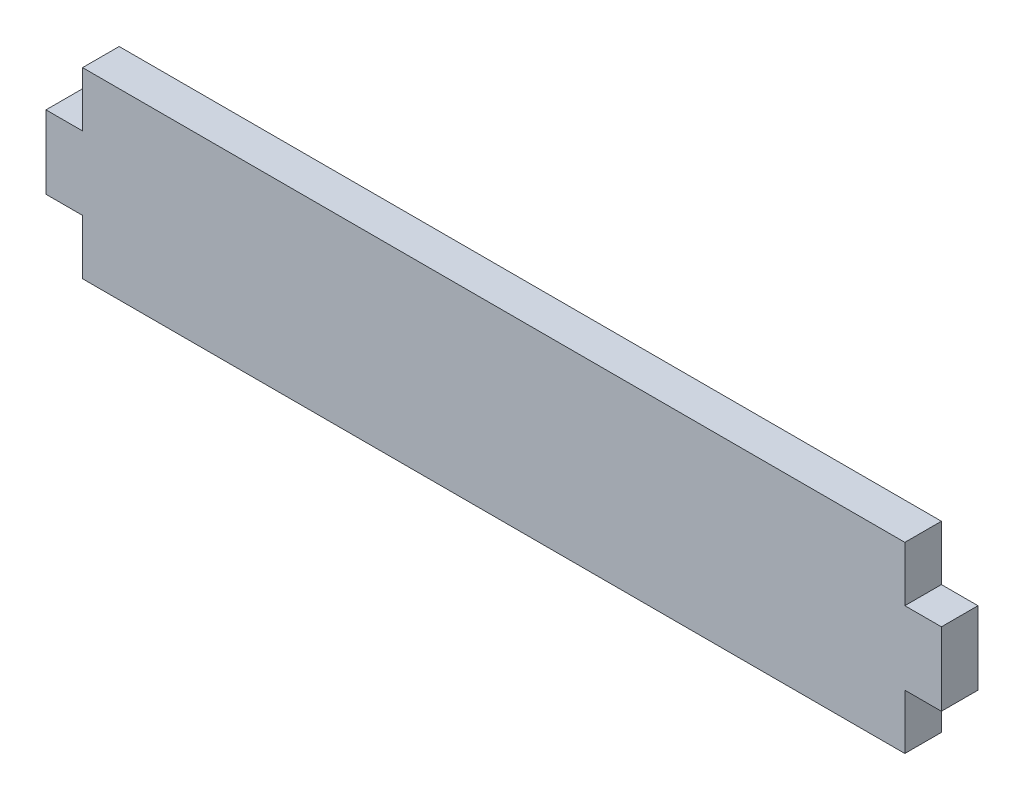
ISO-10303-21;
HEADER;
FILE_DESCRIPTION(('STEP AP214'),'2;1');
FILE_NAME('part.step','',(''),(''),'','','');
FILE_SCHEMA(('AUTOMOTIVE_DESIGN { 1 0 10303 214 1 1 1 1 }'));
ENDSEC;
DATA;
#1=APPLICATION_CONTEXT('core data for automotive mechanical design processes');
#2=APPLICATION_PROTOCOL_DEFINITION('international standard','automotive_design',2000,#1);
#3=PRODUCT_CONTEXT('',#1,'mechanical');
#4=PRODUCT('Part','Part','',(#3));
#5=PRODUCT_RELATED_PRODUCT_CATEGORY('part','',(#4));
#6=PRODUCT_DEFINITION_FORMATION('','',#4);
#7=PRODUCT_DEFINITION_CONTEXT('part definition',#1,'design');
#8=PRODUCT_DEFINITION('design','',#6,#7);
#9=PRODUCT_DEFINITION_SHAPE('','',#8);
#10=(LENGTH_UNIT() NAMED_UNIT(*) SI_UNIT(.MILLI.,.METRE.));
#11=(NAMED_UNIT(*) PLANE_ANGLE_UNIT() SI_UNIT($,.RADIAN.));
#12=(NAMED_UNIT(*) SI_UNIT($,.STERADIAN.) SOLID_ANGLE_UNIT());
#13=UNCERTAINTY_MEASURE_WITH_UNIT(LENGTH_MEASURE(1.E-05),#10,'distance_accuracy_value','');
#14=(GEOMETRIC_REPRESENTATION_CONTEXT(3) GLOBAL_UNCERTAINTY_ASSIGNED_CONTEXT((#13)) GLOBAL_UNIT_ASSIGNED_CONTEXT((#10,
#11,#12)) REPRESENTATION_CONTEXT('',''));
#15=CARTESIAN_POINT('',(0.,0.,0.));
#16=DIRECTION('',(0.,0.,1.));
#17=DIRECTION('',(1.,0.,0.));
#18=AXIS2_PLACEMENT_3D('',#15,#16,#17);
#19=CARTESIAN_POINT('',(56.2,-5.,5.));
#20=DIRECTION('',(-1.,0.,0.));
#21=DIRECTION('',(0.,0.,1.));
#22=AXIS2_PLACEMENT_3D('',#19,#20,#21);
#23=PLANE('',#22);
#24=DIRECTION('',(0.,1.,0.));
#25=VECTOR('',#24,1.);
#26=CARTESIAN_POINT('',(56.2,-5.,0.));
#27=LINE('',#26,#25);
#28=CARTESIAN_POINT('',(56.2,-12.5,0.));
#29=VERTEX_POINT('',#28);
#30=CARTESIAN_POINT('',(56.2,-5.,0.));
#31=VERTEX_POINT('',#30);
#32=EDGE_CURVE('E156',#29,#31,#27,.T.);
#33=ORIENTED_EDGE('',*,*,#32,.T.);
#34=DIRECTION('',(0.,0.,-1.));
#35=VECTOR('',#34,1.);
#36=CARTESIAN_POINT('',(56.2,-5.,5.));
#37=LINE('',#36,#35);
#38=CARTESIAN_POINT('',(56.2,-5.,5.));
#39=VERTEX_POINT('',#38);
#40=EDGE_CURVE('E11',#39,#31,#37,.T.);
#41=ORIENTED_EDGE('',*,*,#40,.F.);
#42=DIRECTION('',(0.,1.,0.));
#43=VECTOR('',#42,1.);
#44=CARTESIAN_POINT('',(56.2,-5.,5.));
#45=LINE('',#44,#43);
#46=CARTESIAN_POINT('',(56.2,-12.5,5.));
#47=VERTEX_POINT('',#46);
#48=EDGE_CURVE('E178',#47,#39,#45,.T.);
#49=ORIENTED_EDGE('',*,*,#48,.F.);
#50=DIRECTION('',(0.,0.,-1.));
#51=VECTOR('',#50,1.);
#52=CARTESIAN_POINT('',(56.2,-12.5,5.));
#53=LINE('',#52,#51);
#54=EDGE_CURVE('E152',#47,#29,#53,.T.);
#55=ORIENTED_EDGE('',*,*,#54,.T.);
#56=EDGE_LOOP('',(#33,#41,#49,#55));
#57=FACE_BOUND('',#56,.T.);
#58=ADVANCED_FACE('F36',(#57),#23,.F.);
#59=CARTESIAN_POINT('',(61.2000000000001,-5.,5.));
#60=DIRECTION('',(0.,1.,0.));
#61=DIRECTION('',(-1.,0.,0.));
#62=AXIS2_PLACEMENT_3D('',#59,#60,#61);
#63=PLANE('',#62);
#64=DIRECTION('',(1.,0.,0.));
#65=VECTOR('',#64,1.);
#66=CARTESIAN_POINT('',(61.2000000000001,-5.,0.));
#67=LINE('',#66,#65);
#68=CARTESIAN_POINT('',(61.2000000000001,-5.,0.));
#69=VERTEX_POINT('',#68);
#70=EDGE_CURVE('E159',#31,#69,#67,.T.);
#71=ORIENTED_EDGE('',*,*,#70,.T.);
#72=DIRECTION('',(0.,0.,-1.));
#73=VECTOR('',#72,1.);
#74=CARTESIAN_POINT('',(61.2000000000001,-5.,5.));
#75=LINE('',#74,#73);
#76=CARTESIAN_POINT('',(61.2000000000001,-5.,5.));
#77=VERTEX_POINT('',#76);
#78=EDGE_CURVE('E44',#77,#69,#75,.T.);
#79=ORIENTED_EDGE('',*,*,#78,.F.);
#80=DIRECTION('',(1.,0.,0.));
#81=VECTOR('',#80,1.);
#82=CARTESIAN_POINT('',(61.2000000000001,-5.,5.));
#83=LINE('',#82,#81);
#84=EDGE_CURVE('E107',#39,#77,#83,.T.);
#85=ORIENTED_EDGE('',*,*,#84,.F.);
#86=ORIENTED_EDGE('',*,*,#40,.T.);
#87=EDGE_LOOP('',(#71,#79,#85,#86));
#88=FACE_BOUND('',#87,.T.);
#89=ADVANCED_FACE('F256',(#88),#63,.F.);
#90=CARTESIAN_POINT('',(61.2,5.,5.));
#91=DIRECTION('',(-1.,0.,0.));
#92=DIRECTION('',(0.,-1.,0.));
#93=AXIS2_PLACEMENT_3D('',#90,#91,#92);
#94=PLANE('',#93);
#95=DIRECTION('',(0.,1.,0.));
#96=VECTOR('',#95,1.);
#97=CARTESIAN_POINT('',(61.2,5.,0.));
#98=LINE('',#97,#96);
#99=CARTESIAN_POINT('',(61.2,5.,0.));
#100=VERTEX_POINT('',#99);
#101=EDGE_CURVE('E161',#69,#100,#98,.T.);
#102=ORIENTED_EDGE('',*,*,#101,.T.);
#103=DIRECTION('',(0.,0.,-1.));
#104=VECTOR('',#103,1.);
#105=CARTESIAN_POINT('',(61.2,5.,5.));
#106=LINE('',#105,#104);
#107=CARTESIAN_POINT('',(61.2,5.,5.));
#108=VERTEX_POINT('',#107);
#109=EDGE_CURVE('E197',#108,#100,#106,.T.);
#110=ORIENTED_EDGE('',*,*,#109,.F.);
#111=DIRECTION('',(0.,1.,0.));
#112=VECTOR('',#111,1.);
#113=CARTESIAN_POINT('',(61.2,5.,5.));
#114=LINE('',#113,#112);
#115=EDGE_CURVE('E205',#77,#108,#114,.T.);
#116=ORIENTED_EDGE('',*,*,#115,.F.);
#117=ORIENTED_EDGE('',*,*,#78,.T.);
#118=EDGE_LOOP('',(#102,#110,#116,#117));
#119=FACE_BOUND('',#118,.T.);
#120=ADVANCED_FACE('F203',(#119),#94,.F.);
#121=CARTESIAN_POINT('',(61.2,5.,5.));
#122=DIRECTION('',(0.,-1.,0.));
#123=DIRECTION('',(1.,0.,0.));
#124=AXIS2_PLACEMENT_3D('',#121,#122,#123);
#125=PLANE('',#124);
#126=DIRECTION('',(-1.,0.,0.));
#127=VECTOR('',#126,1.);
#128=CARTESIAN_POINT('',(61.2,5.,0.));
#129=LINE('',#128,#127);
#130=CARTESIAN_POINT('',(56.2,5.,0.));
#131=VERTEX_POINT('',#130);
#132=EDGE_CURVE('E163',#100,#131,#129,.T.);
#133=ORIENTED_EDGE('',*,*,#132,.T.);
#134=DIRECTION('',(0.,0.,-1.));
#135=VECTOR('',#134,1.);
#136=CARTESIAN_POINT('',(56.2,5.,5.));
#137=LINE('',#136,#135);
#138=CARTESIAN_POINT('',(56.2,5.,5.));
#139=VERTEX_POINT('',#138);
#140=EDGE_CURVE('E194',#139,#131,#137,.T.);
#141=ORIENTED_EDGE('',*,*,#140,.F.);
#142=DIRECTION('',(-1.,0.,0.));
#143=VECTOR('',#142,1.);
#144=CARTESIAN_POINT('',(61.2,5.,5.));
#145=LINE('',#144,#143);
#146=EDGE_CURVE('E223',#108,#139,#145,.T.);
#147=ORIENTED_EDGE('',*,*,#146,.F.);
#148=ORIENTED_EDGE('',*,*,#109,.T.);
#149=EDGE_LOOP('',(#133,#141,#147,#148));
#150=FACE_BOUND('',#149,.T.);
#151=ADVANCED_FACE('F214',(#150),#125,.F.);
#152=CARTESIAN_POINT('',(56.2,12.5,5.));
#153=DIRECTION('',(-1.,0.,0.));
#154=DIRECTION('',(0.,0.,1.));
#155=AXIS2_PLACEMENT_3D('',#152,#153,#154);
#156=PLANE('',#155);
#157=DIRECTION('',(0.,1.,0.));
#158=VECTOR('',#157,1.);
#159=CARTESIAN_POINT('',(56.2,12.5,0.));
#160=LINE('',#159,#158);
#161=CARTESIAN_POINT('',(56.2,12.5,0.));
#162=VERTEX_POINT('',#161);
#163=EDGE_CURVE('E165',#131,#162,#160,.T.);
#164=ORIENTED_EDGE('',*,*,#163,.T.);
#165=DIRECTION('',(0.,0.,-1.));
#166=VECTOR('',#165,1.);
#167=CARTESIAN_POINT('',(56.2,12.5,5.));
#168=LINE('',#167,#166);
#169=CARTESIAN_POINT('',(56.2,12.5,5.));
#170=VERTEX_POINT('',#169);
#171=EDGE_CURVE('E191',#170,#162,#168,.T.);
#172=ORIENTED_EDGE('',*,*,#171,.F.);
#173=DIRECTION('',(0.,1.,0.));
#174=VECTOR('',#173,1.);
#175=CARTESIAN_POINT('',(56.2,12.5,5.));
#176=LINE('',#175,#174);
#177=EDGE_CURVE('E220',#139,#170,#176,.T.);
#178=ORIENTED_EDGE('',*,*,#177,.F.);
#179=ORIENTED_EDGE('',*,*,#140,.T.);
#180=EDGE_LOOP('',(#164,#172,#178,#179));
#181=FACE_BOUND('',#180,.T.);
#182=ADVANCED_FACE('F218',(#181),#156,.F.);
#183=CARTESIAN_POINT('',(-56.2,12.5,5.));
#184=DIRECTION('',(0.,-1.,0.));
#185=DIRECTION('',(0.,0.,-1.));
#186=AXIS2_PLACEMENT_3D('',#183,#184,#185);
#187=PLANE('',#186);
#188=DIRECTION('',(-1.,0.,0.));
#189=VECTOR('',#188,1.);
#190=CARTESIAN_POINT('',(-56.2,12.5,0.));
#191=LINE('',#190,#189);
#192=CARTESIAN_POINT('',(-56.2,12.5,0.));
#193=VERTEX_POINT('',#192);
#194=EDGE_CURVE('E167',#162,#193,#191,.T.);
#195=ORIENTED_EDGE('',*,*,#194,.T.);
#196=DIRECTION('',(0.,0.,-1.));
#197=VECTOR('',#196,1.);
#198=CARTESIAN_POINT('',(-56.2,12.5,5.));
#199=LINE('',#198,#197);
#200=CARTESIAN_POINT('',(-56.2,12.5,5.));
#201=VERTEX_POINT('',#200);
#202=EDGE_CURVE('E188',#201,#193,#199,.T.);
#203=ORIENTED_EDGE('',*,*,#202,.F.);
#204=DIRECTION('',(-1.,0.,0.));
#205=VECTOR('',#204,1.);
#206=CARTESIAN_POINT('',(-56.2,12.5,5.));
#207=LINE('',#206,#205);
#208=EDGE_CURVE('E222',#170,#201,#207,.T.);
#209=ORIENTED_EDGE('',*,*,#208,.F.);
#210=ORIENTED_EDGE('',*,*,#171,.T.);
#211=EDGE_LOOP('',(#195,#203,#209,#210));
#212=FACE_BOUND('',#211,.T.);
#213=ADVANCED_FACE('F269',(#212),#187,.F.);
#214=CARTESIAN_POINT('',(-56.2,12.5,5.));
#215=DIRECTION('',(1.,0.,0.));
#216=DIRECTION('',(0.,0.,-1.));
#217=AXIS2_PLACEMENT_3D('',#214,#215,#216);
#218=PLANE('',#217);
#219=DIRECTION('',(0.,-1.,0.));
#220=VECTOR('',#219,1.);
#221=CARTESIAN_POINT('',(-56.2,12.5,0.));
#222=LINE('',#221,#220);
#223=CARTESIAN_POINT('',(-56.2,5.,0.));
#224=VERTEX_POINT('',#223);
#225=EDGE_CURVE('E169',#193,#224,#222,.T.);
#226=ORIENTED_EDGE('',*,*,#225,.T.);
#227=DIRECTION('',(0.,0.,-1.));
#228=VECTOR('',#227,1.);
#229=CARTESIAN_POINT('',(-56.2,5.,5.));
#230=LINE('',#229,#228);
#231=CARTESIAN_POINT('',(-56.2,5.,5.));
#232=VERTEX_POINT('',#231);
#233=EDGE_CURVE('E185',#232,#224,#230,.T.);
#234=ORIENTED_EDGE('',*,*,#233,.F.);
#235=DIRECTION('',(0.,-1.,0.));
#236=VECTOR('',#235,1.);
#237=CARTESIAN_POINT('',(-56.2,12.5,5.));
#238=LINE('',#237,#236);
#239=EDGE_CURVE('E225',#201,#232,#238,.T.);
#240=ORIENTED_EDGE('',*,*,#239,.F.);
#241=ORIENTED_EDGE('',*,*,#202,.T.);
#242=EDGE_LOOP('',(#226,#234,#240,#241));
#243=FACE_BOUND('',#242,.T.);
#244=ADVANCED_FACE('F272',(#243),#218,.F.);
#245=CARTESIAN_POINT('',(-61.2,5.,5.));
#246=DIRECTION('',(0.,-1.,0.));
#247=DIRECTION('',(0.,0.,-1.));
#248=AXIS2_PLACEMENT_3D('',#245,#246,#247);
#249=PLANE('',#248);
#250=DIRECTION('',(-1.,0.,0.));
#251=VECTOR('',#250,1.);
#252=CARTESIAN_POINT('',(-61.2,5.,0.));
#253=LINE('',#252,#251);
#254=CARTESIAN_POINT('',(-61.2,5.,0.));
#255=VERTEX_POINT('',#254);
#256=EDGE_CURVE('E171',#224,#255,#253,.T.);
#257=ORIENTED_EDGE('',*,*,#256,.T.);
#258=DIRECTION('',(0.,0.,-1.));
#259=VECTOR('',#258,1.);
#260=CARTESIAN_POINT('',(-61.2,5.,5.));
#261=LINE('',#260,#259);
#262=CARTESIAN_POINT('',(-61.2,5.,5.));
#263=VERTEX_POINT('',#262);
#264=EDGE_CURVE('E182',#263,#255,#261,.T.);
#265=ORIENTED_EDGE('',*,*,#264,.F.);
#266=DIRECTION('',(-1.,0.,0.));
#267=VECTOR('',#266,1.);
#268=CARTESIAN_POINT('',(-61.2,5.,5.));
#269=LINE('',#268,#267);
#270=EDGE_CURVE('E231',#232,#263,#269,.T.);
#271=ORIENTED_EDGE('',*,*,#270,.F.);
#272=ORIENTED_EDGE('',*,*,#233,.T.);
#273=EDGE_LOOP('',(#257,#265,#271,#272));
#274=FACE_BOUND('',#273,.T.);
#275=ADVANCED_FACE('F237',(#274),#249,.F.);
#276=CARTESIAN_POINT('',(-61.2,5.,5.));
#277=DIRECTION('',(1.,0.,0.));
#278=DIRECTION('',(0.,0.,-1.));
#279=AXIS2_PLACEMENT_3D('',#276,#277,#278);
#280=PLANE('',#279);
#281=DIRECTION('',(0.,-1.,0.));
#282=VECTOR('',#281,1.);
#283=CARTESIAN_POINT('',(-61.2,5.,0.));
#284=LINE('',#283,#282);
#285=CARTESIAN_POINT('',(-61.2,-5.,0.));
#286=VERTEX_POINT('',#285);
#287=EDGE_CURVE('E173',#255,#286,#284,.T.);
#288=ORIENTED_EDGE('',*,*,#287,.T.);
#289=DIRECTION('',(0.,0.,-1.));
#290=VECTOR('',#289,1.);
#291=CARTESIAN_POINT('',(-61.2,-5.,5.));
#292=LINE('',#291,#290);
#293=CARTESIAN_POINT('',(-61.2,-5.,5.));
#294=VERTEX_POINT('',#293);
#295=EDGE_CURVE('E147',#294,#286,#292,.T.);
#296=ORIENTED_EDGE('',*,*,#295,.F.);
#297=DIRECTION('',(0.,-1.,0.));
#298=VECTOR('',#297,1.);
#299=CARTESIAN_POINT('',(-61.2,5.,5.));
#300=LINE('',#299,#298);
#301=EDGE_CURVE('E138',#263,#294,#300,.T.);
#302=ORIENTED_EDGE('',*,*,#301,.F.);
#303=ORIENTED_EDGE('',*,*,#264,.T.);
#304=EDGE_LOOP('',(#288,#296,#302,#303));
#305=FACE_BOUND('',#304,.T.);
#306=ADVANCED_FACE('F241',(#305),#280,.F.);
#307=CARTESIAN_POINT('',(-61.2,-5.,5.));
#308=DIRECTION('',(0.,1.,0.));
#309=DIRECTION('',(0.,0.,1.));
#310=AXIS2_PLACEMENT_3D('',#307,#308,#309);
#311=PLANE('',#310);
#312=DIRECTION('',(1.,0.,0.));
#313=VECTOR('',#312,1.);
#314=CARTESIAN_POINT('',(-61.2,-5.,0.));
#315=LINE('',#314,#313);
#316=CARTESIAN_POINT('',(-56.2,-5.,0.));
#317=VERTEX_POINT('',#316);
#318=EDGE_CURVE('E146',#286,#317,#315,.T.);
#319=ORIENTED_EDGE('',*,*,#318,.T.);
#320=DIRECTION('',(0.,0.,-1.));
#321=VECTOR('',#320,1.);
#322=CARTESIAN_POINT('',(-56.2,-5.,5.));
#323=LINE('',#322,#321);
#324=CARTESIAN_POINT('',(-56.2,-5.,5.));
#325=VERTEX_POINT('',#324);
#326=EDGE_CURVE('E143',#325,#317,#323,.T.);
#327=ORIENTED_EDGE('',*,*,#326,.F.);
#328=DIRECTION('',(1.,0.,0.));
#329=VECTOR('',#328,1.);
#330=CARTESIAN_POINT('',(-61.2,-5.,5.));
#331=LINE('',#330,#329);
#332=EDGE_CURVE('E132',#294,#325,#331,.T.);
#333=ORIENTED_EDGE('',*,*,#332,.F.);
#334=ORIENTED_EDGE('',*,*,#295,.T.);
#335=EDGE_LOOP('',(#319,#327,#333,#334));
#336=FACE_BOUND('',#335,.T.);
#337=ADVANCED_FACE('F144',(#336),#311,.F.);
#338=CARTESIAN_POINT('',(-56.2,-5.,5.));
#339=DIRECTION('',(1.,0.,0.));
#340=DIRECTION('',(0.,1.,0.));
#341=AXIS2_PLACEMENT_3D('',#338,#339,#340);
#342=PLANE('',#341);
#343=DIRECTION('',(0.,-1.,0.));
#344=VECTOR('',#343,1.);
#345=CARTESIAN_POINT('',(-56.2,-5.,0.));
#346=LINE('',#345,#344);
#347=CARTESIAN_POINT('',(-56.2,-12.5,0.));
#348=VERTEX_POINT('',#347);
#349=EDGE_CURVE('E93',#317,#348,#346,.T.);
#350=ORIENTED_EDGE('',*,*,#349,.T.);
#351=DIRECTION('',(0.,0.,-1.));
#352=VECTOR('',#351,1.);
#353=CARTESIAN_POINT('',(-56.2,-12.5,5.));
#354=LINE('',#353,#352);
#355=CARTESIAN_POINT('',(-56.2,-12.5,5.));
#356=VERTEX_POINT('',#355);
#357=EDGE_CURVE('E148',#356,#348,#354,.T.);
#358=ORIENTED_EDGE('',*,*,#357,.F.);
#359=DIRECTION('',(0.,-1.,0.));
#360=VECTOR('',#359,1.);
#361=CARTESIAN_POINT('',(-56.2,-5.,5.));
#362=LINE('',#361,#360);
#363=EDGE_CURVE('E136',#325,#356,#362,.T.);
#364=ORIENTED_EDGE('',*,*,#363,.F.);
#365=ORIENTED_EDGE('',*,*,#326,.T.);
#366=EDGE_LOOP('',(#350,#358,#364,#365));
#367=FACE_BOUND('',#366,.T.);
#368=ADVANCED_FACE('F150',(#367),#342,.F.);
#369=CARTESIAN_POINT('',(-56.2,-12.5,5.));
#370=DIRECTION('',(0.,1.,0.));
#371=DIRECTION('',(0.,0.,1.));
#372=AXIS2_PLACEMENT_3D('',#369,#370,#371);
#373=PLANE('',#372);
#374=DIRECTION('',(1.,0.,0.));
#375=VECTOR('',#374,1.);
#376=CARTESIAN_POINT('',(-56.2,-12.5,0.));
#377=LINE('',#376,#375);
#378=EDGE_CURVE('E99',#348,#29,#377,.T.);
#379=ORIENTED_EDGE('',*,*,#378,.T.);
#380=ORIENTED_EDGE('',*,*,#54,.F.);
#381=DIRECTION('',(1.,0.,0.));
#382=VECTOR('',#381,1.);
#383=CARTESIAN_POINT('',(-56.2,-12.5,5.));
#384=LINE('',#383,#382);
#385=EDGE_CURVE('E52',#356,#47,#384,.T.);
#386=ORIENTED_EDGE('',*,*,#385,.F.);
#387=ORIENTED_EDGE('',*,*,#357,.T.);
#388=EDGE_LOOP('',(#379,#380,#386,#387));
#389=FACE_BOUND('',#388,.T.);
#390=ADVANCED_FACE('F245',(#389),#373,.F.);
#391=CARTESIAN_POINT('',(0.,0.,5.));
#392=DIRECTION('',(0.,0.,1.));
#393=DIRECTION('',(1.,0.,0.));
#394=AXIS2_PLACEMENT_3D('',#391,#392,#393);
#395=PLANE('',#394);
#396=ORIENTED_EDGE('',*,*,#48,.T.);
#397=ORIENTED_EDGE('',*,*,#84,.T.);
#398=ORIENTED_EDGE('',*,*,#115,.T.);
#399=ORIENTED_EDGE('',*,*,#146,.T.);
#400=ORIENTED_EDGE('',*,*,#177,.T.);
#401=ORIENTED_EDGE('',*,*,#208,.T.);
#402=ORIENTED_EDGE('',*,*,#239,.T.);
#403=ORIENTED_EDGE('',*,*,#270,.T.);
#404=ORIENTED_EDGE('',*,*,#301,.T.);
#405=ORIENTED_EDGE('',*,*,#332,.T.);
#406=ORIENTED_EDGE('',*,*,#363,.T.);
#407=ORIENTED_EDGE('',*,*,#385,.T.);
#408=EDGE_LOOP('',(#396,#397,#398,#399,#400,#401,#402,#403,#404,#405,#406,#407));
#409=FACE_BOUND('',#408,.T.);
#410=ADVANCED_FACE('F134',(#409),#395,.T.);
#411=CARTESIAN_POINT('',(0.,0.,0.));
#412=DIRECTION('',(0.,0.,1.));
#413=DIRECTION('',(1.,0.,0.));
#414=AXIS2_PLACEMENT_3D('',#411,#412,#413);
#415=PLANE('',#414);
#416=ORIENTED_EDGE('',*,*,#32,.F.);
#417=ORIENTED_EDGE('',*,*,#378,.F.);
#418=ORIENTED_EDGE('',*,*,#349,.F.);
#419=ORIENTED_EDGE('',*,*,#318,.F.);
#420=ORIENTED_EDGE('',*,*,#287,.F.);
#421=ORIENTED_EDGE('',*,*,#256,.F.);
#422=ORIENTED_EDGE('',*,*,#225,.F.);
#423=ORIENTED_EDGE('',*,*,#194,.F.);
#424=ORIENTED_EDGE('',*,*,#163,.F.);
#425=ORIENTED_EDGE('',*,*,#132,.F.);
#426=ORIENTED_EDGE('',*,*,#101,.F.);
#427=ORIENTED_EDGE('',*,*,#70,.F.);
#428=EDGE_LOOP('',(#416,#417,#418,#419,#420,#421,#422,#423,#424,#425,#426,#427));
#429=FACE_BOUND('',#428,.T.);
#430=ADVANCED_FACE('F209',(#429),#415,.F.);
#431=CLOSED_SHELL('',(#58,#89,#120,#151,#182,#213,#244,#275,#306,#337,#368,#390,#410,#430));
#432=MANIFOLD_SOLID_BREP('B2',#431);
#433=ADVANCED_BREP_SHAPE_REPRESENTATION('',(#18,#432),#14);
#434=SHAPE_DEFINITION_REPRESENTATION(#9,#433);
ENDSEC;
END-ISO-10303-21;
